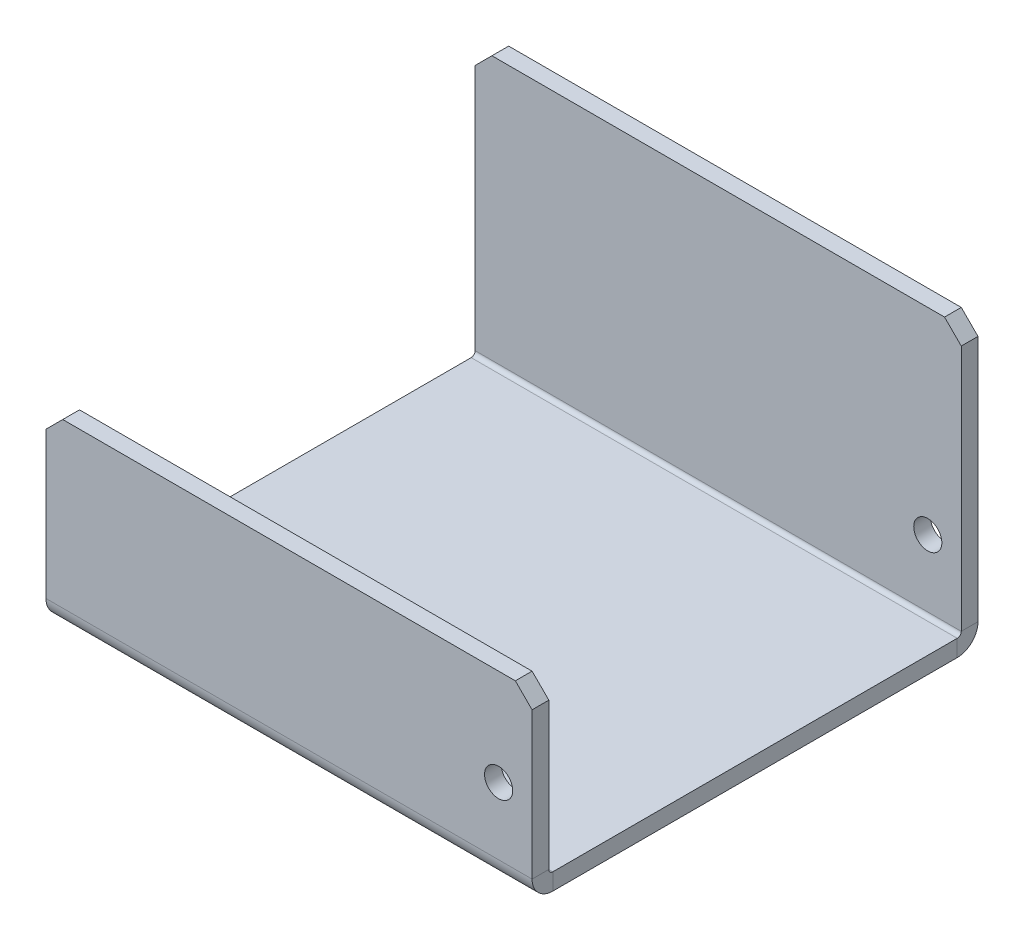
ISO-10303-21;
HEADER;
FILE_DESCRIPTION(('STEP AP214'),'2;1');
FILE_NAME('part.step','',(''),(''),'','','');
FILE_SCHEMA(('AUTOMOTIVE_DESIGN { 1 0 10303 214 1 1 1 1 }'));
ENDSEC;
DATA;
#1=APPLICATION_CONTEXT('core data for automotive mechanical design processes');
#2=APPLICATION_PROTOCOL_DEFINITION('international standard','automotive_design',2000,#1);
#3=PRODUCT_CONTEXT('',#1,'mechanical');
#4=PRODUCT('Part','Part','',(#3));
#5=PRODUCT_RELATED_PRODUCT_CATEGORY('part','',(#4));
#6=PRODUCT_DEFINITION_FORMATION('','',#4);
#7=PRODUCT_DEFINITION_CONTEXT('part definition',#1,'design');
#8=PRODUCT_DEFINITION('design','',#6,#7);
#9=PRODUCT_DEFINITION_SHAPE('','',#8);
#10=(LENGTH_UNIT() NAMED_UNIT(*) SI_UNIT(.MILLI.,.METRE.));
#11=(NAMED_UNIT(*) PLANE_ANGLE_UNIT() SI_UNIT($,.RADIAN.));
#12=(NAMED_UNIT(*) SI_UNIT($,.STERADIAN.) SOLID_ANGLE_UNIT());
#13=UNCERTAINTY_MEASURE_WITH_UNIT(LENGTH_MEASURE(1.E-05),#10,'distance_accuracy_value','');
#14=(GEOMETRIC_REPRESENTATION_CONTEXT(3) GLOBAL_UNCERTAINTY_ASSIGNED_CONTEXT((#13)) GLOBAL_UNIT_ASSIGNED_CONTEXT((#10,
#11,#12)) REPRESENTATION_CONTEXT('',''));
#15=CARTESIAN_POINT('',(0.,0.,0.));
#16=DIRECTION('',(0.,0.,1.));
#17=DIRECTION('',(1.,0.,0.));
#18=AXIS2_PLACEMENT_3D('',#15,#16,#17);
#19=CARTESIAN_POINT('',(0.,3.175,-78.232));
#20=DIRECTION('',(0.,-1.,0.));
#21=DIRECTION('',(0.,0.,-1.));
#22=AXIS2_PLACEMENT_3D('',#19,#20,#21);
#23=PLANE('',#22);
#24=DIRECTION('',(1.,0.,0.));
#25=VECTOR('',#24,1.);
#26=CARTESIAN_POINT('',(92.202,3.175,-0.761999999999999));
#27=LINE('',#26,#25);
#28=CARTESIAN_POINT('',(92.202,3.175,-0.761999999999999));
#29=VERTEX_POINT('',#28);
#30=CARTESIAN_POINT('',(0.,3.175,-0.761999999999999));
#31=VERTEX_POINT('',#30);
#32=EDGE_CURVE('E208',#29,#31,#27,.F.);
#33=ORIENTED_EDGE('',*,*,#32,.F.);
#34=DIRECTION('',(0.,0.,-1.));
#35=VECTOR('',#34,1.);
#36=CARTESIAN_POINT('',(92.202,3.175,0.));
#37=LINE('',#36,#35);
#38=CARTESIAN_POINT('',(92.202,3.17499999999999,-77.47));
#39=VERTEX_POINT('',#38);
#40=EDGE_CURVE('E267',#29,#39,#37,.T.);
#41=ORIENTED_EDGE('',*,*,#40,.T.);
#42=DIRECTION('',(-1.,0.,0.));
#43=VECTOR('',#42,1.);
#44=CARTESIAN_POINT('',(0.,3.17499999999999,-77.47));
#45=LINE('',#44,#43);
#46=CARTESIAN_POINT('',(0.,3.17499999999999,-77.47));
#47=VERTEX_POINT('',#46);
#48=EDGE_CURVE('E253',#47,#39,#45,.F.);
#49=ORIENTED_EDGE('',*,*,#48,.F.);
#50=DIRECTION('',(0.,0.,1.));
#51=VECTOR('',#50,1.);
#52=CARTESIAN_POINT('',(0.,3.175,0.));
#53=LINE('',#52,#51);
#54=EDGE_CURVE('E264',#47,#31,#53,.T.);
#55=ORIENTED_EDGE('',*,*,#54,.T.);
#56=EDGE_LOOP('',(#33,#41,#49,#55));
#57=FACE_BOUND('',#56,.T.);
#58=ADVANCED_FACE('F39',(#57),#23,.F.);
#59=CARTESIAN_POINT('',(0.,0.,-78.232));
#60=DIRECTION('',(0.,-1.,0.));
#61=DIRECTION('',(0.,0.,-1.));
#62=AXIS2_PLACEMENT_3D('',#59,#60,#61);
#63=PLANE('',#62);
#64=DIRECTION('',(0.,0.,-1.));
#65=VECTOR('',#64,1.);
#66=CARTESIAN_POINT('',(92.202,0.,-78.232));
#67=LINE('',#66,#65);
#68=CARTESIAN_POINT('',(92.202,0.,-0.761999999999998));
#69=VERTEX_POINT('',#68);
#70=CARTESIAN_POINT('',(92.202,0.,-77.47));
#71=VERTEX_POINT('',#70);
#72=EDGE_CURVE('E268',#69,#71,#67,.T.);
#73=ORIENTED_EDGE('',*,*,#72,.F.);
#74=DIRECTION('',(1.,0.,0.));
#75=VECTOR('',#74,1.);
#76=CARTESIAN_POINT('',(92.202,0.,-0.761999999999998));
#77=LINE('',#76,#75);
#78=CARTESIAN_POINT('',(0.,0.,-0.761999999999998));
#79=VERTEX_POINT('',#78);
#80=EDGE_CURVE('E162',#69,#79,#77,.F.);
#81=ORIENTED_EDGE('',*,*,#80,.T.);
#82=DIRECTION('',(0.,0.,-1.));
#83=VECTOR('',#82,1.);
#84=CARTESIAN_POINT('',(0.,0.,-78.232));
#85=LINE('',#84,#83);
#86=CARTESIAN_POINT('',(0.,0.,-77.47));
#87=VERTEX_POINT('',#86);
#88=EDGE_CURVE('E261',#87,#79,#85,.F.);
#89=ORIENTED_EDGE('',*,*,#88,.F.);
#90=DIRECTION('',(-1.,0.,0.));
#91=VECTOR('',#90,1.);
#92=CARTESIAN_POINT('',(0.,0.,-77.47));
#93=LINE('',#92,#91);
#94=EDGE_CURVE('E240',#87,#71,#93,.F.);
#95=ORIENTED_EDGE('',*,*,#94,.T.);
#96=EDGE_LOOP('',(#73,#81,#89,#95));
#97=FACE_BOUND('',#96,.T.);
#98=ADVANCED_FACE('F346',(#97),#63,.T.);
#99=CARTESIAN_POINT('',(92.202,3.175,0.));
#100=DIRECTION('',(-1.,0.,0.));
#101=DIRECTION('',(0.,0.,-1.));
#102=AXIS2_PLACEMENT_3D('',#99,#100,#101);
#103=PLANE('',#102);
#104=ORIENTED_EDGE('',*,*,#40,.F.);
#105=DIRECTION('',(0.,-1.,0.));
#106=VECTOR('',#105,1.);
#107=CARTESIAN_POINT('',(92.202,3.175,-0.761999999999999));
#108=LINE('',#107,#106);
#109=EDGE_CURVE('E204',#29,#69,#108,.T.);
#110=ORIENTED_EDGE('',*,*,#109,.T.);
#111=ORIENTED_EDGE('',*,*,#72,.T.);
#112=DIRECTION('',(0.,-1.,0.));
#113=VECTOR('',#112,1.);
#114=CARTESIAN_POINT('',(92.202,3.17499999999999,-77.47));
#115=LINE('',#114,#113);
#116=EDGE_CURVE('E258',#39,#71,#115,.T.);
#117=ORIENTED_EDGE('',*,*,#116,.F.);
#118=EDGE_LOOP('',(#104,#110,#111,#117));
#119=FACE_BOUND('',#118,.T.);
#120=ADVANCED_FACE('F343',(#119),#103,.F.);
#121=CARTESIAN_POINT('',(0.,3.175,0.));
#122=DIRECTION('',(1.,0.,0.));
#123=DIRECTION('',(0.,0.,1.));
#124=AXIS2_PLACEMENT_3D('',#121,#122,#123);
#125=PLANE('',#124);
#126=DIRECTION('',(0.,-1.,0.));
#127=VECTOR('',#126,1.);
#128=CARTESIAN_POINT('',(0.,3.175,-0.761999999999999));
#129=LINE('',#128,#127);
#130=EDGE_CURVE('E211',#31,#79,#129,.T.);
#131=ORIENTED_EDGE('',*,*,#130,.F.);
#132=ORIENTED_EDGE('',*,*,#54,.F.);
#133=DIRECTION('',(0.,-1.,0.));
#134=VECTOR('',#133,1.);
#135=CARTESIAN_POINT('',(0.,3.17499999999999,-77.47));
#136=LINE('',#135,#134);
#137=EDGE_CURVE('E247',#47,#87,#136,.T.);
#138=ORIENTED_EDGE('',*,*,#137,.T.);
#139=ORIENTED_EDGE('',*,*,#88,.T.);
#140=EDGE_LOOP('',(#131,#132,#138,#139));
#141=FACE_BOUND('',#140,.T.);
#142=ADVANCED_FACE('F350',(#141),#125,.F.);
#143=CARTESIAN_POINT('',(92.202,3.93699999999999,-77.47));
#144=DIRECTION('',(1.,0.,0.));
#145=DIRECTION('',(0.,0.,-1.));
#146=AXIS2_PLACEMENT_3D('',#143,#144,#145);
#147=PLANE('',#146);
#148=DIRECTION('',(0.,0.,-1.));
#149=VECTOR('',#148,1.);
#150=CARTESIAN_POINT('',(92.202,3.937,-78.232));
#151=LINE('',#150,#149);
#152=CARTESIAN_POINT('',(92.202,3.93699999999999,-78.232));
#153=VERTEX_POINT('',#152);
#154=CARTESIAN_POINT('',(92.202,3.93699999999998,-81.407));
#155=VERTEX_POINT('',#154);
#156=EDGE_CURVE('E214',#153,#155,#151,.T.);
#157=ORIENTED_EDGE('',*,*,#156,.F.);
#158=CARTESIAN_POINT('',(92.202,3.93699999999999,-77.47));
#159=DIRECTION('',(-1.,0.,0.));
#160=DIRECTION('',(0.,0.,1.));
#161=AXIS2_PLACEMENT_3D('',#158,#159,#160);
#162=CIRCLE('',#161,0.761999999999999);
#163=EDGE_CURVE('E250',#39,#153,#162,.F.);
#164=ORIENTED_EDGE('',*,*,#163,.F.);
#165=ORIENTED_EDGE('',*,*,#116,.T.);
#166=CARTESIAN_POINT('',(92.202,3.93699999999999,-77.47));
#167=DIRECTION('',(-1.,0.,0.));
#168=DIRECTION('',(0.,0.,1.));
#169=AXIS2_PLACEMENT_3D('',#166,#167,#168);
#170=CIRCLE('',#169,3.937);
#171=EDGE_CURVE('E243',#71,#155,#170,.F.);
#172=ORIENTED_EDGE('',*,*,#171,.T.);
#173=EDGE_LOOP('',(#157,#164,#165,#172));
#174=FACE_BOUND('',#173,.T.);
#175=ADVANCED_FACE('F331',(#174),#147,.T.);
#176=CARTESIAN_POINT('',(0.,3.93699999999999,-77.47));
#177=DIRECTION('',(1.,0.,0.));
#178=DIRECTION('',(0.,0.,-1.));
#179=AXIS2_PLACEMENT_3D('',#176,#177,#178);
#180=PLANE('',#179);
#181=CARTESIAN_POINT('',(0.,3.93699999999999,-77.47));
#182=DIRECTION('',(-1.,0.,0.));
#183=DIRECTION('',(0.,0.,1.));
#184=AXIS2_PLACEMENT_3D('',#181,#182,#183);
#185=CIRCLE('',#184,0.761999999999999);
#186=CARTESIAN_POINT('',(0.,3.93699999999999,-78.232));
#187=VERTEX_POINT('',#186);
#188=EDGE_CURVE('E234',#187,#47,#185,.T.);
#189=ORIENTED_EDGE('',*,*,#188,.F.);
#190=DIRECTION('',(0.,0.,-1.));
#191=VECTOR('',#190,1.);
#192=CARTESIAN_POINT('',(0.,3.937,-78.232));
#193=LINE('',#192,#191);
#194=CARTESIAN_POINT('',(0.,3.93700000000002,-81.407));
#195=VERTEX_POINT('',#194);
#196=EDGE_CURVE('E218',#187,#195,#193,.T.);
#197=ORIENTED_EDGE('',*,*,#196,.T.);
#198=CARTESIAN_POINT('',(0.,3.93699999999999,-77.47));
#199=DIRECTION('',(-1.,0.,0.));
#200=DIRECTION('',(0.,0.,1.));
#201=AXIS2_PLACEMENT_3D('',#198,#199,#200);
#202=CIRCLE('',#201,3.937);
#203=EDGE_CURVE('E244',#195,#87,#202,.T.);
#204=ORIENTED_EDGE('',*,*,#203,.T.);
#205=ORIENTED_EDGE('',*,*,#137,.F.);
#206=EDGE_LOOP('',(#189,#197,#204,#205));
#207=FACE_BOUND('',#206,.T.);
#208=ADVANCED_FACE('F325',(#207),#180,.F.);
#209=CARTESIAN_POINT('',(0.,3.93699999999999,-77.47));
#210=DIRECTION('',(-1.,0.,0.));
#211=DIRECTION('',(0.,0.,-1.));
#212=AXIS2_PLACEMENT_3D('',#209,#210,#211);
#213=CYLINDRICAL_SURFACE('',#212,3.937);
#214=ORIENTED_EDGE('',*,*,#94,.F.);
#215=ORIENTED_EDGE('',*,*,#203,.F.);
#216=DIRECTION('',(1.,0.,0.));
#217=VECTOR('',#216,1.);
#218=CARTESIAN_POINT('',(92.202,3.93700000000002,-81.407));
#219=LINE('',#218,#217);
#220=EDGE_CURVE('E221',#195,#155,#219,.T.);
#221=ORIENTED_EDGE('',*,*,#220,.T.);
#222=ORIENTED_EDGE('',*,*,#171,.F.);
#223=EDGE_LOOP('',(#214,#215,#221,#222));
#224=FACE_BOUND('',#223,.T.);
#225=ADVANCED_FACE('F328',(#224),#213,.T.);
#226=CARTESIAN_POINT('',(0.,3.93699999999999,-77.47));
#227=DIRECTION('',(-1.,0.,0.));
#228=DIRECTION('',(0.,0.,-1.));
#229=AXIS2_PLACEMENT_3D('',#226,#227,#228);
#230=CYLINDRICAL_SURFACE('',#229,0.761999999999999);
#231=ORIENTED_EDGE('',*,*,#48,.T.);
#232=ORIENTED_EDGE('',*,*,#163,.T.);
#233=DIRECTION('',(-1.,0.,0.));
#234=VECTOR('',#233,1.);
#235=CARTESIAN_POINT('',(92.202,3.937,-78.232));
#236=LINE('',#235,#234);
#237=EDGE_CURVE('E216',#153,#187,#236,.T.);
#238=ORIENTED_EDGE('',*,*,#237,.T.);
#239=ORIENTED_EDGE('',*,*,#188,.T.);
#240=EDGE_LOOP('',(#231,#232,#238,#239));
#241=FACE_BOUND('',#240,.T.);
#242=ADVANCED_FACE('F339',(#241),#230,.F.);
#243=CARTESIAN_POINT('',(92.202,3.17499999999999,-81.407));
#244=DIRECTION('',(-1.,0.,0.));
#245=DIRECTION('',(0.,0.,1.));
#246=AXIS2_PLACEMENT_3D('',#243,#244,#245);
#247=PLANE('',#246);
#248=DIRECTION('',(0.,-1.,0.));
#249=VECTOR('',#248,1.);
#250=CARTESIAN_POINT('',(92.202,3.17499999999999,-81.407));
#251=LINE('',#250,#249);
#252=CARTESIAN_POINT('',(92.202,50.8,-81.4070000000002));
#253=VERTEX_POINT('',#252);
#254=EDGE_CURVE('E227',#253,#155,#251,.T.);
#255=ORIENTED_EDGE('',*,*,#254,.F.);
#256=DIRECTION('',(0.,0.,1.));
#257=VECTOR('',#256,1.);
#258=CARTESIAN_POINT('',(92.202,50.8,-81.4070000000002));
#259=LINE('',#258,#257);
#260=CARTESIAN_POINT('',(92.202,50.8,-78.2320000000002));
#261=VERTEX_POINT('',#260);
#262=EDGE_CURVE('E11',#253,#261,#259,.T.);
#263=ORIENTED_EDGE('',*,*,#262,.T.);
#264=DIRECTION('',(0.,-1.,0.));
#265=VECTOR('',#264,1.);
#266=CARTESIAN_POINT('',(92.202,3.175,-78.232));
#267=LINE('',#266,#265);
#268=EDGE_CURVE('E226',#261,#153,#267,.T.);
#269=ORIENTED_EDGE('',*,*,#268,.T.);
#270=ORIENTED_EDGE('',*,*,#156,.T.);
#271=EDGE_LOOP('',(#255,#263,#269,#270));
#272=FACE_BOUND('',#271,.T.);
#273=ADVANCED_FACE('F335',(#272),#247,.F.);
#274=CARTESIAN_POINT('',(0.,53.975,-81.4070000000002));
#275=DIRECTION('',(1.,0.,0.));
#276=DIRECTION('',(0.,0.,-1.));
#277=AXIS2_PLACEMENT_3D('',#274,#275,#276);
#278=PLANE('',#277);
#279=DIRECTION('',(0.,1.,0.));
#280=VECTOR('',#279,1.);
#281=CARTESIAN_POINT('',(0.,53.975,-78.2320000000002));
#282=LINE('',#281,#280);
#283=CARTESIAN_POINT('',(0.,50.8,-78.2320000000002));
#284=VERTEX_POINT('',#283);
#285=EDGE_CURVE('E236',#187,#284,#282,.T.);
#286=ORIENTED_EDGE('',*,*,#285,.T.);
#287=DIRECTION('',(0.,0.,-1.));
#288=VECTOR('',#287,1.);
#289=CARTESIAN_POINT('',(0.,50.8,-81.4070000000002));
#290=LINE('',#289,#288);
#291=CARTESIAN_POINT('',(0.,50.8,-81.4070000000002));
#292=VERTEX_POINT('',#291);
#293=EDGE_CURVE('E62',#284,#292,#290,.T.);
#294=ORIENTED_EDGE('',*,*,#293,.T.);
#295=DIRECTION('',(0.,1.,0.));
#296=VECTOR('',#295,1.);
#297=CARTESIAN_POINT('',(0.,53.975,-81.4070000000002));
#298=LINE('',#297,#296);
#299=EDGE_CURVE('E229',#195,#292,#298,.T.);
#300=ORIENTED_EDGE('',*,*,#299,.F.);
#301=ORIENTED_EDGE('',*,*,#196,.F.);
#302=EDGE_LOOP('',(#286,#294,#300,#301));
#303=FACE_BOUND('',#302,.T.);
#304=ADVANCED_FACE('F322',(#303),#278,.F.);
#305=CARTESIAN_POINT('',(92.202,53.975,-81.4070000000002));
#306=DIRECTION('',(0.,0.,1.));
#307=DIRECTION('',(0.,-1.,0.));
#308=AXIS2_PLACEMENT_3D('',#305,#306,#307);
#309=PLANE('',#308);
#310=CARTESIAN_POINT('',(85.852,16.637,-81.4070000000002));
#311=DIRECTION('',(0.,0.,1.));
#312=DIRECTION('',(1.,0.,0.));
#313=AXIS2_PLACEMENT_3D('',#310,#311,#312);
#314=CIRCLE('',#313,2.66700000000001);
#315=CARTESIAN_POINT('',(88.519,16.637,-81.4070000000002));
#316=VERTEX_POINT('',#315);
#317=EDGE_CURVE('E278',#316,#316,#314,.T.);
#318=ORIENTED_EDGE('',*,*,#317,.T.);
#319=EDGE_LOOP('',(#318));
#320=FACE_BOUND('',#319,.T.);
#321=ORIENTED_EDGE('',*,*,#299,.T.);
#322=DIRECTION('',(-0.707106781186549,-0.707106781186546,0.));
#323=VECTOR('',#322,1.);
#324=CARTESIAN_POINT('',(3.17500000000001,53.975,-81.4070000000002));
#325=LINE('',#324,#323);
#326=CARTESIAN_POINT('',(3.17500000000001,53.975,-81.4070000000002));
#327=VERTEX_POINT('',#326);
#328=EDGE_CURVE('E305',#292,#327,#325,.F.);
#329=ORIENTED_EDGE('',*,*,#328,.T.);
#330=DIRECTION('',(1.,0.,0.));
#331=VECTOR('',#330,1.);
#332=CARTESIAN_POINT('',(92.202,53.975,-81.4070000000002));
#333=LINE('',#332,#331);
#334=CARTESIAN_POINT('',(89.027,53.975,-81.4070000000002));
#335=VERTEX_POINT('',#334);
#336=EDGE_CURVE('E232',#327,#335,#333,.T.);
#337=ORIENTED_EDGE('',*,*,#336,.T.);
#338=DIRECTION('',(-0.707106781186548,0.707106781186548,0.));
#339=VECTOR('',#338,1.);
#340=CARTESIAN_POINT('',(92.202,50.8,-81.4070000000002));
#341=LINE('',#340,#339);
#342=EDGE_CURVE('E54',#335,#253,#341,.F.);
#343=ORIENTED_EDGE('',*,*,#342,.T.);
#344=ORIENTED_EDGE('',*,*,#254,.T.);
#345=ORIENTED_EDGE('',*,*,#220,.F.);
#346=EDGE_LOOP('',(#321,#329,#337,#343,#344,#345));
#347=FACE_BOUND('',#346,.T.);
#348=ADVANCED_FACE('F308',(#320,#347),#309,.F.);
#349=CARTESIAN_POINT('',(92.202,53.975,-78.2320000000002));
#350=DIRECTION('',(0.,0.,1.));
#351=DIRECTION('',(0.,-1.,0.));
#352=AXIS2_PLACEMENT_3D('',#349,#350,#351);
#353=PLANE('',#352);
#354=CARTESIAN_POINT('',(85.852,16.637,-78.232));
#355=DIRECTION('',(0.,0.,1.));
#356=DIRECTION('',(0.,-1.,0.));
#357=AXIS2_PLACEMENT_3D('',#354,#355,#356);
#358=CIRCLE('',#357,2.66700000000001);
#359=CARTESIAN_POINT('',(85.852,13.97,-78.232));
#360=VERTEX_POINT('',#359);
#361=EDGE_CURVE('E277',#360,#360,#358,.T.);
#362=ORIENTED_EDGE('',*,*,#361,.F.);
#363=EDGE_LOOP('',(#362));
#364=FACE_BOUND('',#363,.T.);
#365=DIRECTION('',(1.,0.,0.));
#366=VECTOR('',#365,1.);
#367=CARTESIAN_POINT('',(92.202,53.975,-78.2320000000002));
#368=LINE('',#367,#366);
#369=CARTESIAN_POINT('',(3.17500000000001,53.975,-78.2320000000002));
#370=VERTEX_POINT('',#369);
#371=CARTESIAN_POINT('',(89.027,53.975,-78.2320000000002));
#372=VERTEX_POINT('',#371);
#373=EDGE_CURVE('E230',#370,#372,#368,.T.);
#374=ORIENTED_EDGE('',*,*,#373,.F.);
#375=DIRECTION('',(0.707106781186549,0.707106781186546,0.));
#376=VECTOR('',#375,1.);
#377=CARTESIAN_POINT('',(47.6885000000002,98.4885,-78.2320000000003));
#378=LINE('',#377,#376);
#379=EDGE_CURVE('E301',#370,#284,#378,.F.);
#380=ORIENTED_EDGE('',*,*,#379,.T.);
#381=ORIENTED_EDGE('',*,*,#285,.F.);
#382=ORIENTED_EDGE('',*,*,#237,.F.);
#383=ORIENTED_EDGE('',*,*,#268,.F.);
#384=DIRECTION('',(0.707106781186548,-0.707106781186548,0.));
#385=VECTOR('',#384,1.);
#386=CARTESIAN_POINT('',(90.6145,52.3875,-78.2320000000002));
#387=LINE('',#386,#385);
#388=EDGE_CURVE('E299',#261,#372,#387,.F.);
#389=ORIENTED_EDGE('',*,*,#388,.T.);
#390=EDGE_LOOP('',(#374,#380,#381,#382,#383,#389));
#391=FACE_BOUND('',#390,.T.);
#392=ADVANCED_FACE('F319',(#364,#391),#353,.T.);
#393=CARTESIAN_POINT('',(92.202,53.975,-81.4070000000002));
#394=DIRECTION('',(0.,-1.,0.));
#395=DIRECTION('',(0.,0.,-1.));
#396=AXIS2_PLACEMENT_3D('',#393,#394,#395);
#397=PLANE('',#396);
#398=ORIENTED_EDGE('',*,*,#336,.F.);
#399=DIRECTION('',(0.,0.,1.));
#400=VECTOR('',#399,1.);
#401=CARTESIAN_POINT('',(3.17500000000001,53.975,-81.4070000000002));
#402=LINE('',#401,#400);
#403=EDGE_CURVE('E296',#327,#370,#402,.T.);
#404=ORIENTED_EDGE('',*,*,#403,.T.);
#405=ORIENTED_EDGE('',*,*,#373,.T.);
#406=DIRECTION('',(0.,0.,-1.));
#407=VECTOR('',#406,1.);
#408=CARTESIAN_POINT('',(89.027,53.975,-81.4070000000002));
#409=LINE('',#408,#407);
#410=EDGE_CURVE('E294',#372,#335,#409,.T.);
#411=ORIENTED_EDGE('',*,*,#410,.T.);
#412=EDGE_LOOP('',(#398,#404,#405,#411));
#413=FACE_BOUND('',#412,.T.);
#414=ADVANCED_FACE('F313',(#413),#397,.F.);
#415=CARTESIAN_POINT('',(0.,3.937,-0.761999999999999));
#416=DIRECTION('',(-1.,0.,0.));
#417=DIRECTION('',(0.,0.,1.));
#418=AXIS2_PLACEMENT_3D('',#415,#416,#417);
#419=PLANE('',#418);
#420=DIRECTION('',(0.,0.,1.));
#421=VECTOR('',#420,1.);
#422=CARTESIAN_POINT('',(0.,3.937,0.));
#423=LINE('',#422,#421);
#424=CARTESIAN_POINT('',(0.,3.937,0.));
#425=VERTEX_POINT('',#424);
#426=CARTESIAN_POINT('',(0.,3.937,3.175));
#427=VERTEX_POINT('',#426);
#428=EDGE_CURVE('E362',#425,#427,#423,.T.);
#429=ORIENTED_EDGE('',*,*,#428,.F.);
#430=CARTESIAN_POINT('',(0.,3.937,-0.761999999999999));
#431=DIRECTION('',(1.,0.,0.));
#432=DIRECTION('',(0.,0.,-1.));
#433=AXIS2_PLACEMENT_3D('',#430,#431,#432);
#434=CIRCLE('',#433,0.761999999999999);
#435=EDGE_CURVE('E165',#31,#425,#434,.F.);
#436=ORIENTED_EDGE('',*,*,#435,.F.);
#437=ORIENTED_EDGE('',*,*,#130,.T.);
#438=CARTESIAN_POINT('',(0.,3.937,-0.761999999999999));
#439=DIRECTION('',(1.,0.,0.));
#440=DIRECTION('',(0.,0.,-1.));
#441=AXIS2_PLACEMENT_3D('',#438,#439,#440);
#442=CIRCLE('',#441,3.937);
#443=EDGE_CURVE('E203',#79,#427,#442,.F.);
#444=ORIENTED_EDGE('',*,*,#443,.T.);
#445=EDGE_LOOP('',(#429,#436,#437,#444));
#446=FACE_BOUND('',#445,.T.);
#447=ADVANCED_FACE('F360',(#446),#419,.T.);
#448=CARTESIAN_POINT('',(92.202,3.937,-0.761999999999999));
#449=DIRECTION('',(-1.,0.,0.));
#450=DIRECTION('',(0.,0.,1.));
#451=AXIS2_PLACEMENT_3D('',#448,#449,#450);
#452=PLANE('',#451);
#453=CARTESIAN_POINT('',(92.202,3.937,-0.761999999999999));
#454=DIRECTION('',(1.,0.,0.));
#455=DIRECTION('',(0.,0.,-1.));
#456=AXIS2_PLACEMENT_3D('',#453,#454,#455);
#457=CIRCLE('',#456,0.761999999999999);
#458=CARTESIAN_POINT('',(92.202,3.937,0.));
#459=VERTEX_POINT('',#458);
#460=EDGE_CURVE('E172',#459,#29,#457,.T.);
#461=ORIENTED_EDGE('',*,*,#460,.F.);
#462=DIRECTION('',(0.,0.,1.));
#463=VECTOR('',#462,1.);
#464=CARTESIAN_POINT('',(92.202,3.937,0.));
#465=LINE('',#464,#463);
#466=CARTESIAN_POINT('',(92.202,3.937,3.175));
#467=VERTEX_POINT('',#466);
#468=EDGE_CURVE('E169',#459,#467,#465,.T.);
#469=ORIENTED_EDGE('',*,*,#468,.T.);
#470=CARTESIAN_POINT('',(92.202,3.937,-0.761999999999999));
#471=DIRECTION('',(1.,0.,0.));
#472=DIRECTION('',(0.,0.,-1.));
#473=AXIS2_PLACEMENT_3D('',#470,#471,#472);
#474=CIRCLE('',#473,3.937);
#475=EDGE_CURVE('E155',#467,#69,#474,.T.);
#476=ORIENTED_EDGE('',*,*,#475,.T.);
#477=ORIENTED_EDGE('',*,*,#109,.F.);
#478=EDGE_LOOP('',(#461,#469,#476,#477));
#479=FACE_BOUND('',#478,.T.);
#480=ADVANCED_FACE('F170',(#479),#452,.F.);
#481=CARTESIAN_POINT('',(92.202,3.937,-0.761999999999999));
#482=DIRECTION('',(1.,0.,0.));
#483=DIRECTION('',(0.,0.,1.));
#484=AXIS2_PLACEMENT_3D('',#481,#482,#483);
#485=CYLINDRICAL_SURFACE('',#484,3.937);
#486=ORIENTED_EDGE('',*,*,#80,.F.);
#487=ORIENTED_EDGE('',*,*,#475,.F.);
#488=DIRECTION('',(-1.,0.,0.));
#489=VECTOR('',#488,1.);
#490=CARTESIAN_POINT('',(0.,3.937,3.175));
#491=LINE('',#490,#489);
#492=EDGE_CURVE('E159',#467,#427,#491,.T.);
#493=ORIENTED_EDGE('',*,*,#492,.T.);
#494=ORIENTED_EDGE('',*,*,#443,.F.);
#495=EDGE_LOOP('',(#486,#487,#493,#494));
#496=FACE_BOUND('',#495,.T.);
#497=ADVANCED_FACE('F157',(#496),#485,.T.);
#498=CARTESIAN_POINT('',(92.202,3.937,-0.761999999999999));
#499=DIRECTION('',(1.,0.,0.));
#500=DIRECTION('',(0.,0.,1.));
#501=AXIS2_PLACEMENT_3D('',#498,#499,#500);
#502=CYLINDRICAL_SURFACE('',#501,0.761999999999999);
#503=ORIENTED_EDGE('',*,*,#32,.T.);
#504=ORIENTED_EDGE('',*,*,#435,.T.);
#505=DIRECTION('',(1.,0.,0.));
#506=VECTOR('',#505,1.);
#507=CARTESIAN_POINT('',(0.,3.937,0.));
#508=LINE('',#507,#506);
#509=EDGE_CURVE('E177',#425,#459,#508,.T.);
#510=ORIENTED_EDGE('',*,*,#509,.T.);
#511=ORIENTED_EDGE('',*,*,#460,.T.);
#512=EDGE_LOOP('',(#503,#504,#510,#511));
#513=FACE_BOUND('',#512,.T.);
#514=ADVANCED_FACE('F356',(#513),#502,.F.);
#515=CARTESIAN_POINT('',(0.,3.175,3.175));
#516=DIRECTION('',(1.,0.,0.));
#517=DIRECTION('',(0.,0.,-1.));
#518=AXIS2_PLACEMENT_3D('',#515,#516,#517);
#519=PLANE('',#518);
#520=DIRECTION('',(0.,-1.,0.));
#521=VECTOR('',#520,1.);
#522=CARTESIAN_POINT('',(0.,3.175,3.175));
#523=LINE('',#522,#521);
#524=CARTESIAN_POINT('',(0.,31.75,3.175));
#525=VERTEX_POINT('',#524);
#526=EDGE_CURVE('E186',#525,#427,#523,.T.);
#527=ORIENTED_EDGE('',*,*,#526,.F.);
#528=DIRECTION('',(0.,0.,-1.));
#529=VECTOR('',#528,1.);
#530=CARTESIAN_POINT('',(0.,31.75,3.175));
#531=LINE('',#530,#529);
#532=CARTESIAN_POINT('',(0.,31.75,0.));
#533=VERTEX_POINT('',#532);
#534=EDGE_CURVE('E270',#525,#533,#531,.T.);
#535=ORIENTED_EDGE('',*,*,#534,.T.);
#536=DIRECTION('',(0.,-1.,0.));
#537=VECTOR('',#536,1.);
#538=CARTESIAN_POINT('',(0.,3.175,0.));
#539=LINE('',#538,#537);
#540=EDGE_CURVE('E187',#533,#425,#539,.T.);
#541=ORIENTED_EDGE('',*,*,#540,.T.);
#542=ORIENTED_EDGE('',*,*,#428,.T.);
#543=EDGE_LOOP('',(#527,#535,#541,#542));
#544=FACE_BOUND('',#543,.T.);
#545=ADVANCED_FACE('F419',(#544),#519,.F.);
#546=CARTESIAN_POINT('',(92.202,34.925,3.175));
#547=DIRECTION('',(-1.,0.,0.));
#548=DIRECTION('',(0.,0.,1.));
#549=AXIS2_PLACEMENT_3D('',#546,#547,#548);
#550=PLANE('',#549);
#551=DIRECTION('',(0.,1.,0.));
#552=VECTOR('',#551,1.);
#553=CARTESIAN_POINT('',(92.202,34.925,0.));
#554=LINE('',#553,#552);
#555=CARTESIAN_POINT('',(92.202,31.75,0.));
#556=VERTEX_POINT('',#555);
#557=EDGE_CURVE('E198',#459,#556,#554,.T.);
#558=ORIENTED_EDGE('',*,*,#557,.T.);
#559=DIRECTION('',(0.,0.,1.));
#560=VECTOR('',#559,1.);
#561=CARTESIAN_POINT('',(92.202,31.75,3.175));
#562=LINE('',#561,#560);
#563=CARTESIAN_POINT('',(92.202,31.75,3.175));
#564=VERTEX_POINT('',#563);
#565=EDGE_CURVE('E47',#556,#564,#562,.T.);
#566=ORIENTED_EDGE('',*,*,#565,.T.);
#567=DIRECTION('',(0.,1.,0.));
#568=VECTOR('',#567,1.);
#569=CARTESIAN_POINT('',(92.202,34.925,3.175));
#570=LINE('',#569,#568);
#571=EDGE_CURVE('E183',#467,#564,#570,.T.);
#572=ORIENTED_EDGE('',*,*,#571,.F.);
#573=ORIENTED_EDGE('',*,*,#468,.F.);
#574=EDGE_LOOP('',(#558,#566,#572,#573));
#575=FACE_BOUND('',#574,.T.);
#576=ADVANCED_FACE('F189',(#575),#550,.F.);
#577=CARTESIAN_POINT('',(0.,34.925,3.175));
#578=DIRECTION('',(0.,0.,-1.));
#579=DIRECTION('',(-1.,0.,0.));
#580=AXIS2_PLACEMENT_3D('',#577,#578,#579);
#581=PLANE('',#580);
#582=CARTESIAN_POINT('',(85.852,16.637,3.175));
#583=DIRECTION('',(0.,0.,1.));
#584=DIRECTION('',(1.,0.,0.));
#585=AXIS2_PLACEMENT_3D('',#582,#583,#584);
#586=CIRCLE('',#585,2.66700000000001);
#587=CARTESIAN_POINT('',(88.519,16.637,3.175));
#588=VERTEX_POINT('',#587);
#589=EDGE_CURVE('E369',#588,#588,#586,.T.);
#590=ORIENTED_EDGE('',*,*,#589,.F.);
#591=EDGE_LOOP('',(#590));
#592=FACE_BOUND('',#591,.T.);
#593=DIRECTION('',(-1.,0.,0.));
#594=VECTOR('',#593,1.);
#595=CARTESIAN_POINT('',(0.,34.925,3.175));
#596=LINE('',#595,#594);
#597=CARTESIAN_POINT('',(89.027,34.925,3.175));
#598=VERTEX_POINT('',#597);
#599=CARTESIAN_POINT('',(3.17500000000001,34.925,3.175));
#600=VERTEX_POINT('',#599);
#601=EDGE_CURVE('E191',#598,#600,#596,.T.);
#602=ORIENTED_EDGE('',*,*,#601,.T.);
#603=DIRECTION('',(0.707106781186549,0.707106781186546,0.));
#604=VECTOR('',#603,1.);
#605=CARTESIAN_POINT('',(0.,31.75,3.175));
#606=LINE('',#605,#604);
#607=EDGE_CURVE('E292',#600,#525,#606,.F.);
#608=ORIENTED_EDGE('',*,*,#607,.T.);
#609=ORIENTED_EDGE('',*,*,#526,.T.);
#610=ORIENTED_EDGE('',*,*,#492,.F.);
#611=ORIENTED_EDGE('',*,*,#571,.T.);
#612=DIRECTION('',(0.707106781186548,-0.707106781186548,0.));
#613=VECTOR('',#612,1.);
#614=CARTESIAN_POINT('',(89.027,34.925,3.175));
#615=LINE('',#614,#613);
#616=EDGE_CURVE('E290',#564,#598,#615,.F.);
#617=ORIENTED_EDGE('',*,*,#616,.T.);
#618=EDGE_LOOP('',(#602,#608,#609,#610,#611,#617));
#619=FACE_BOUND('',#618,.T.);
#620=ADVANCED_FACE('F182',(#592,#619),#581,.F.);
#621=CARTESIAN_POINT('',(0.,34.925,0.));
#622=DIRECTION('',(0.,0.,-1.));
#623=DIRECTION('',(-1.,0.,0.));
#624=AXIS2_PLACEMENT_3D('',#621,#622,#623);
#625=PLANE('',#624);
#626=CARTESIAN_POINT('',(85.852,16.637,0.));
#627=DIRECTION('',(0.,0.,-1.));
#628=DIRECTION('',(-1.,0.,0.));
#629=AXIS2_PLACEMENT_3D('',#626,#627,#628);
#630=CIRCLE('',#629,2.66700000000001);
#631=CARTESIAN_POINT('',(83.185,16.637,0.));
#632=VERTEX_POINT('',#631);
#633=EDGE_CURVE('E274',#632,#632,#630,.T.);
#634=ORIENTED_EDGE('',*,*,#633,.F.);
#635=EDGE_LOOP('',(#634));
#636=FACE_BOUND('',#635,.T.);
#637=ORIENTED_EDGE('',*,*,#540,.F.);
#638=DIRECTION('',(-0.707106781186549,-0.707106781186546,0.));
#639=VECTOR('',#638,1.);
#640=CARTESIAN_POINT('',(1.5875,33.3375,0.));
#641=LINE('',#640,#639);
#642=CARTESIAN_POINT('',(3.17500000000001,34.925,0.));
#643=VERTEX_POINT('',#642);
#644=EDGE_CURVE('E283',#533,#643,#641,.F.);
#645=ORIENTED_EDGE('',*,*,#644,.T.);
#646=DIRECTION('',(-1.,0.,0.));
#647=VECTOR('',#646,1.);
#648=CARTESIAN_POINT('',(0.,34.925,0.));
#649=LINE('',#648,#647);
#650=CARTESIAN_POINT('',(89.027,34.925,0.));
#651=VERTEX_POINT('',#650);
#652=EDGE_CURVE('E194',#651,#643,#649,.T.);
#653=ORIENTED_EDGE('',*,*,#652,.F.);
#654=DIRECTION('',(-0.707106781186548,0.707106781186548,0.));
#655=VECTOR('',#654,1.);
#656=CARTESIAN_POINT('',(44.5135,79.4385,0.));
#657=LINE('',#656,#655);
#658=EDGE_CURVE('E281',#651,#556,#657,.F.);
#659=ORIENTED_EDGE('',*,*,#658,.T.);
#660=ORIENTED_EDGE('',*,*,#557,.F.);
#661=ORIENTED_EDGE('',*,*,#509,.F.);
#662=EDGE_LOOP('',(#637,#645,#653,#659,#660,#661));
#663=FACE_BOUND('',#662,.T.);
#664=ADVANCED_FACE('F422',(#636,#663),#625,.T.);
#665=CARTESIAN_POINT('',(0.,34.925,3.175));
#666=DIRECTION('',(0.,-1.,0.));
#667=DIRECTION('',(0.,0.,-1.));
#668=AXIS2_PLACEMENT_3D('',#665,#666,#667);
#669=PLANE('',#668);
#670=ORIENTED_EDGE('',*,*,#652,.T.);
#671=DIRECTION('',(0.,0.,1.));
#672=VECTOR('',#671,1.);
#673=CARTESIAN_POINT('',(3.17500000000001,34.925,3.175));
#674=LINE('',#673,#672);
#675=EDGE_CURVE('E288',#643,#600,#674,.T.);
#676=ORIENTED_EDGE('',*,*,#675,.T.);
#677=ORIENTED_EDGE('',*,*,#601,.F.);
#678=DIRECTION('',(0.,0.,-1.));
#679=VECTOR('',#678,1.);
#680=CARTESIAN_POINT('',(89.027,34.925,3.175));
#681=LINE('',#680,#679);
#682=EDGE_CURVE('E285',#598,#651,#681,.T.);
#683=ORIENTED_EDGE('',*,*,#682,.T.);
#684=EDGE_LOOP('',(#670,#676,#677,#683));
#685=FACE_BOUND('',#684,.T.);
#686=ADVANCED_FACE('F388',(#685),#669,.F.);
#687=CARTESIAN_POINT('',(85.852,16.637,-81.4070000000002));
#688=DIRECTION('',(0.,0.,1.));
#689=DIRECTION('',(1.,0.,0.));
#690=AXIS2_PLACEMENT_3D('',#687,#688,#689);
#691=CYLINDRICAL_SURFACE('',#690,2.66700000000001);
#692=ORIENTED_EDGE('',*,*,#633,.T.);
#693=EDGE_LOOP('',(#692));
#694=FACE_BOUND('',#693,.T.);
#695=ORIENTED_EDGE('',*,*,#589,.T.);
#696=EDGE_LOOP('',(#695));
#697=FACE_BOUND('',#696,.T.);
#698=ADVANCED_FACE('F379',(#694,#697),#691,.F.);
#699=ORIENTED_EDGE('',*,*,#361,.T.);
#700=EDGE_LOOP('',(#699));
#701=FACE_BOUND('',#700,.T.);
#702=ORIENTED_EDGE('',*,*,#317,.F.);
#703=EDGE_LOOP('',(#702));
#704=FACE_BOUND('',#703,.T.);
#705=ADVANCED_FACE('F376',(#701,#704),#691,.F.);
#706=CARTESIAN_POINT('',(0.,31.75,3.175));
#707=DIRECTION('',(0.707106781186546,-0.707106781186549,0.));
#708=DIRECTION('',(0.707106781186549,0.707106781186546,0.));
#709=AXIS2_PLACEMENT_3D('',#706,#707,#708);
#710=PLANE('',#709);
#711=ORIENTED_EDGE('',*,*,#607,.F.);
#712=ORIENTED_EDGE('',*,*,#675,.F.);
#713=ORIENTED_EDGE('',*,*,#644,.F.);
#714=ORIENTED_EDGE('',*,*,#534,.F.);
#715=EDGE_LOOP('',(#711,#712,#713,#714));
#716=FACE_BOUND('',#715,.T.);
#717=ADVANCED_FACE('F378',(#716),#710,.F.);
#718=CARTESIAN_POINT('',(3.17500000000001,53.975,-81.4070000000002));
#719=DIRECTION('',(0.707106781186546,-0.707106781186549,0.));
#720=DIRECTION('',(0.707106781186549,0.707106781186546,0.));
#721=AXIS2_PLACEMENT_3D('',#718,#719,#720);
#722=PLANE('',#721);
#723=ORIENTED_EDGE('',*,*,#328,.F.);
#724=ORIENTED_EDGE('',*,*,#293,.F.);
#725=ORIENTED_EDGE('',*,*,#379,.F.);
#726=ORIENTED_EDGE('',*,*,#403,.F.);
#727=EDGE_LOOP('',(#723,#724,#725,#726));
#728=FACE_BOUND('',#727,.T.);
#729=ADVANCED_FACE('F316',(#728),#722,.F.);
#730=CARTESIAN_POINT('',(89.027,34.925,3.175));
#731=DIRECTION('',(-0.707106781186547,-0.707106781186547,0.));
#732=DIRECTION('',(0.707106781186548,-0.707106781186548,0.));
#733=AXIS2_PLACEMENT_3D('',#730,#731,#732);
#734=PLANE('',#733);
#735=ORIENTED_EDGE('',*,*,#616,.F.);
#736=ORIENTED_EDGE('',*,*,#565,.F.);
#737=ORIENTED_EDGE('',*,*,#658,.F.);
#738=ORIENTED_EDGE('',*,*,#682,.F.);
#739=EDGE_LOOP('',(#735,#736,#737,#738));
#740=FACE_BOUND('',#739,.T.);
#741=ADVANCED_FACE('F405',(#740),#734,.F.);
#742=CARTESIAN_POINT('',(92.202,50.8,-81.4070000000002));
#743=DIRECTION('',(-0.707106781186547,-0.707106781186547,0.));
#744=DIRECTION('',(0.707106781186548,-0.707106781186548,0.));
#745=AXIS2_PLACEMENT_3D('',#742,#743,#744);
#746=PLANE('',#745);
#747=ORIENTED_EDGE('',*,*,#342,.F.);
#748=ORIENTED_EDGE('',*,*,#410,.F.);
#749=ORIENTED_EDGE('',*,*,#388,.F.);
#750=ORIENTED_EDGE('',*,*,#262,.F.);
#751=EDGE_LOOP('',(#747,#748,#749,#750));
#752=FACE_BOUND('',#751,.T.);
#753=ADVANCED_FACE('F41',(#752),#746,.F.);
#754=CLOSED_SHELL('',(#58,#98,#120,#142,#175,#208,#225,#242,#273,#304,#348,#392,#414,#447,#480,
#497,#514,#545,#576,#620,#664,#686,#698,#705,#717,#729,#741,#753));
#755=MANIFOLD_SOLID_BREP('B2',#754);
#756=ADVANCED_BREP_SHAPE_REPRESENTATION('',(#18,#755),#14);
#757=SHAPE_DEFINITION_REPRESENTATION(#9,#756);
ENDSEC;
END-ISO-10303-21;
